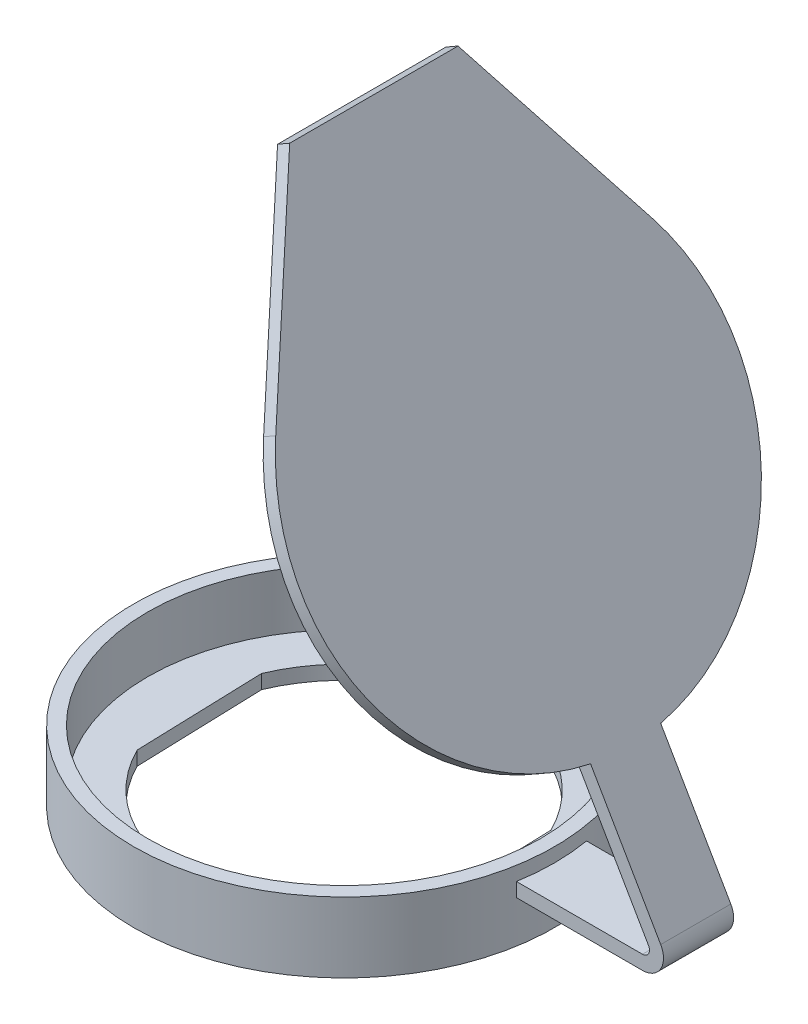
ISO-10303-21;
HEADER;
FILE_DESCRIPTION(('STEP AP214'),'2;1');
FILE_NAME('part.step','',(''),(''),'','','');
FILE_SCHEMA(('AUTOMOTIVE_DESIGN { 1 0 10303 214 1 1 1 1 }'));
ENDSEC;
DATA;
#1=APPLICATION_CONTEXT('core data for automotive mechanical design processes');
#2=APPLICATION_PROTOCOL_DEFINITION('international standard','automotive_design',2000,#1);
#3=PRODUCT_CONTEXT('',#1,'mechanical');
#4=PRODUCT('Part','Part','',(#3));
#5=PRODUCT_RELATED_PRODUCT_CATEGORY('part','',(#4));
#6=PRODUCT_DEFINITION_FORMATION('','',#4);
#7=PRODUCT_DEFINITION_CONTEXT('part definition',#1,'design');
#8=PRODUCT_DEFINITION('design','',#6,#7);
#9=PRODUCT_DEFINITION_SHAPE('','',#8);
#10=(LENGTH_UNIT() NAMED_UNIT(*) SI_UNIT(.MILLI.,.METRE.));
#11=(NAMED_UNIT(*) PLANE_ANGLE_UNIT() SI_UNIT($,.RADIAN.));
#12=(NAMED_UNIT(*) SI_UNIT($,.STERADIAN.) SOLID_ANGLE_UNIT());
#13=UNCERTAINTY_MEASURE_WITH_UNIT(LENGTH_MEASURE(1.E-05),#10,'distance_accuracy_value','');
#14=(GEOMETRIC_REPRESENTATION_CONTEXT(3) GLOBAL_UNCERTAINTY_ASSIGNED_CONTEXT((#13)) GLOBAL_UNIT_ASSIGNED_CONTEXT((#10,
#11,#12)) REPRESENTATION_CONTEXT('',''));
#15=CARTESIAN_POINT('',(0.,0.,0.));
#16=DIRECTION('',(0.,0.,1.));
#17=DIRECTION('',(1.,0.,0.));
#18=AXIS2_PLACEMENT_3D('',#15,#16,#17);
#19=CARTESIAN_POINT('',(0.,5.,0.));
#20=DIRECTION('',(0.,-1.,0.));
#21=DIRECTION('',(0.,0.,-1.));
#22=AXIS2_PLACEMENT_3D('',#19,#20,#21);
#23=CYLINDRICAL_SURFACE('',#22,15.);
#24=CARTESIAN_POINT('',(0.,0.,0.));
#25=DIRECTION('',(0.,1.,0.));
#26=DIRECTION('',(0.,0.,1.));
#27=AXIS2_PLACEMENT_3D('',#24,#25,#26);
#28=CIRCLE('',#27,15.);
#29=CARTESIAN_POINT('',(0.,0.,15.));
#30=VERTEX_POINT('',#29);
#31=EDGE_CURVE('E324',#30,#30,#28,.T.);
#32=ORIENTED_EDGE('',*,*,#31,.T.);
#33=EDGE_LOOP('',(#32));
#34=FACE_BOUND('',#33,.T.);
#35=CARTESIAN_POINT('',(0.,5.,0.));
#36=DIRECTION('',(0.,1.,0.));
#37=DIRECTION('',(0.,0.,1.));
#38=AXIS2_PLACEMENT_3D('',#35,#36,#37);
#39=CIRCLE('',#38,15.);
#40=CARTESIAN_POINT('',(0.,5.,15.));
#41=VERTEX_POINT('',#40);
#42=EDGE_CURVE('E42',#41,#41,#39,.T.);
#43=ORIENTED_EDGE('',*,*,#42,.F.);
#44=EDGE_LOOP('',(#43));
#45=FACE_BOUND('',#44,.T.);
#46=CARTESIAN_POINT('',(0.,4.,0.));
#47=DIRECTION('',(0.,1.,0.));
#48=DIRECTION('',(0.,0.,-1.));
#49=AXIS2_PLACEMENT_3D('',#46,#47,#48);
#50=CIRCLE('',#49,15.);
#51=CARTESIAN_POINT('',(14.790199457749,4.,2.5));
#52=VERTEX_POINT('',#51);
#53=CARTESIAN_POINT('',(14.790199457749,4.,-2.5));
#54=VERTEX_POINT('',#53);
#55=EDGE_CURVE('E232',#52,#54,#50,.T.);
#56=ORIENTED_EDGE('',*,*,#55,.T.);
#57=DIRECTION('',(0.,-1.,0.));
#58=VECTOR('',#57,1.);
#59=CARTESIAN_POINT('',(14.790199457749,4.,-2.5));
#60=LINE('',#59,#58);
#61=CARTESIAN_POINT('',(14.790199457749,3.,-2.5));
#62=VERTEX_POINT('',#61);
#63=EDGE_CURVE('E244',#54,#62,#60,.T.);
#64=ORIENTED_EDGE('',*,*,#63,.T.);
#65=CARTESIAN_POINT('',(0.,3.,0.));
#66=DIRECTION('',(0.,1.,0.));
#67=DIRECTION('',(0.,0.,-1.));
#68=AXIS2_PLACEMENT_3D('',#65,#66,#67);
#69=CIRCLE('',#68,15.);
#70=CARTESIAN_POINT('',(14.790199457749,3.,2.5));
#71=VERTEX_POINT('',#70);
#72=EDGE_CURVE('E231',#71,#62,#69,.T.);
#73=ORIENTED_EDGE('',*,*,#72,.F.);
#74=DIRECTION('',(0.,-1.,0.));
#75=VECTOR('',#74,1.);
#76=CARTESIAN_POINT('',(14.790199457749,4.,2.5));
#77=LINE('',#76,#75);
#78=EDGE_CURVE('E252',#52,#71,#77,.T.);
#79=ORIENTED_EDGE('',*,*,#78,.F.);
#80=EDGE_LOOP('',(#56,#64,#73,#79));
#81=FACE_BOUND('',#80,.T.);
#82=ADVANCED_FACE('F35',(#34,#45,#81),#23,.T.);
#83=CARTESIAN_POINT('',(0.,5.,0.));
#84=DIRECTION('',(0.,1.,0.));
#85=DIRECTION('',(0.,0.,1.));
#86=AXIS2_PLACEMENT_3D('',#83,#84,#85);
#87=PLANE('',#86);
#88=CARTESIAN_POINT('',(0.,5.,0.));
#89=DIRECTION('',(0.,1.,0.));
#90=DIRECTION('',(0.,0.,1.));
#91=AXIS2_PLACEMENT_3D('',#88,#89,#90);
#92=CIRCLE('',#91,14.);
#93=CARTESIAN_POINT('',(0.,5.,14.));
#94=VERTEX_POINT('',#93);
#95=EDGE_CURVE('E321',#94,#94,#92,.T.);
#96=ORIENTED_EDGE('',*,*,#95,.F.);
#97=EDGE_LOOP('',(#96));
#98=FACE_BOUND('',#97,.T.);
#99=ORIENTED_EDGE('',*,*,#42,.T.);
#100=EDGE_LOOP('',(#99));
#101=FACE_BOUND('',#100,.T.);
#102=ADVANCED_FACE('F334',(#98,#101),#87,.T.);
#103=CARTESIAN_POINT('',(0.,0.,0.));
#104=DIRECTION('',(0.,1.,0.));
#105=DIRECTION('',(0.,0.,1.));
#106=AXIS2_PLACEMENT_3D('',#103,#104,#105);
#107=PLANE('',#106);
#108=DIRECTION('',(-0.999489060573524,0.,0.0319627563557251));
#109=VECTOR('',#108,1.);
#110=CARTESIAN_POINT('',(-0.319627563557251,0.,-9.99489060573523));
#111=LINE('',#110,#109);
#112=CARTESIAN_POINT('',(4.26060671280123,0.,-10.1413623561548));
#113=VERTEX_POINT('',#112);
#114=CARTESIAN_POINT('',(-4.89986183991573,0.,-9.84841885531569));
#115=VERTEX_POINT('',#114);
#116=EDGE_CURVE('E312',#113,#115,#111,.T.);
#117=ORIENTED_EDGE('',*,*,#116,.T.);
#118=CARTESIAN_POINT('',(0.,0.,0.));
#119=DIRECTION('',(0.,1.,0.));
#120=DIRECTION('',(0.,0.,1.));
#121=AXIS2_PLACEMENT_3D('',#118,#119,#120);
#122=CIRCLE('',#121,11.);
#123=CARTESIAN_POINT('',(-10.1413623561548,0.,-4.26060671280123));
#124=VERTEX_POINT('',#123);
#125=EDGE_CURVE('E315',#115,#124,#122,.T.);
#126=ORIENTED_EDGE('',*,*,#125,.T.);
#127=DIRECTION('',(0.0319627563557248,0.,0.999489060573524));
#128=VECTOR('',#127,1.);
#129=CARTESIAN_POINT('',(-9.99489060573524,0.,0.319627563557248));
#130=LINE('',#129,#128);
#131=CARTESIAN_POINT('',(-9.8484188553157,0.,4.89986183991572));
#132=VERTEX_POINT('',#131);
#133=EDGE_CURVE('E281',#124,#132,#130,.T.);
#134=ORIENTED_EDGE('',*,*,#133,.T.);
#135=CARTESIAN_POINT('',(0.,0.,0.));
#136=DIRECTION('',(0.,1.,0.));
#137=DIRECTION('',(0.,0.,1.));
#138=AXIS2_PLACEMENT_3D('',#135,#136,#137);
#139=CIRCLE('',#138,11.);
#140=CARTESIAN_POINT('',(-4.26060671280122,0.,10.1413623561548));
#141=VERTEX_POINT('',#140);
#142=EDGE_CURVE('E297',#132,#141,#139,.T.);
#143=ORIENTED_EDGE('',*,*,#142,.T.);
#144=DIRECTION('',(0.999489060573524,0.,-0.031962756355725));
#145=VECTOR('',#144,1.);
#146=CARTESIAN_POINT('',(0.31962756355725,0.,9.99489060573524));
#147=LINE('',#146,#145);
#148=CARTESIAN_POINT('',(4.89986183991572,0.,9.8484188553157));
#149=VERTEX_POINT('',#148);
#150=EDGE_CURVE('E300',#141,#149,#147,.T.);
#151=ORIENTED_EDGE('',*,*,#150,.T.);
#152=CARTESIAN_POINT('',(0.,0.,0.));
#153=DIRECTION('',(0.,1.,0.));
#154=DIRECTION('',(0.,0.,1.));
#155=AXIS2_PLACEMENT_3D('',#152,#153,#154);
#156=CIRCLE('',#155,11.);
#157=CARTESIAN_POINT('',(10.1413623561548,0.,4.26060671280122));
#158=VERTEX_POINT('',#157);
#159=EDGE_CURVE('E303',#149,#158,#156,.T.);
#160=ORIENTED_EDGE('',*,*,#159,.T.);
#161=DIRECTION('',(-0.0319627563557248,0.,-0.999489060573524));
#162=VECTOR('',#161,1.);
#163=CARTESIAN_POINT('',(9.99489060573524,0.,-0.319627563557248));
#164=LINE('',#163,#162);
#165=CARTESIAN_POINT('',(9.8484188553157,0.,-4.89986183991572));
#166=VERTEX_POINT('',#165);
#167=EDGE_CURVE('E306',#158,#166,#164,.T.);
#168=ORIENTED_EDGE('',*,*,#167,.T.);
#169=CARTESIAN_POINT('',(0.,0.,0.));
#170=DIRECTION('',(0.,1.,0.));
#171=DIRECTION('',(0.,0.,1.));
#172=AXIS2_PLACEMENT_3D('',#169,#170,#171);
#173=CIRCLE('',#172,11.);
#174=EDGE_CURVE('E309',#166,#113,#173,.T.);
#175=ORIENTED_EDGE('',*,*,#174,.T.);
#176=EDGE_LOOP('',(#117,#126,#134,#143,#151,#160,#168,#175));
#177=FACE_BOUND('',#176,.T.);
#178=ORIENTED_EDGE('',*,*,#31,.F.);
#179=EDGE_LOOP('',(#178));
#180=FACE_BOUND('',#179,.T.);
#181=ADVANCED_FACE('F331',(#177,#180),#107,.F.);
#182=CARTESIAN_POINT('',(0.,5.,0.));
#183=DIRECTION('',(0.,-1.,0.));
#184=DIRECTION('',(0.,0.,-1.));
#185=AXIS2_PLACEMENT_3D('',#182,#183,#184);
#186=CYLINDRICAL_SURFACE('',#185,14.);
#187=ORIENTED_EDGE('',*,*,#95,.T.);
#188=EDGE_LOOP('',(#187));
#189=FACE_BOUND('',#188,.T.);
#190=CARTESIAN_POINT('',(0.,1.,0.));
#191=DIRECTION('',(0.,1.,0.));
#192=DIRECTION('',(0.,0.,1.));
#193=AXIS2_PLACEMENT_3D('',#190,#191,#192);
#194=CIRCLE('',#193,14.);
#195=CARTESIAN_POINT('',(0.,1.,14.));
#196=VERTEX_POINT('',#195);
#197=EDGE_CURVE('E318',#196,#196,#194,.T.);
#198=ORIENTED_EDGE('',*,*,#197,.F.);
#199=EDGE_LOOP('',(#198));
#200=FACE_BOUND('',#199,.T.);
#201=ADVANCED_FACE('F333',(#189,#200),#186,.F.);
#202=CARTESIAN_POINT('',(0.,1.,0.));
#203=DIRECTION('',(0.,1.,0.));
#204=DIRECTION('',(0.,0.,1.));
#205=AXIS2_PLACEMENT_3D('',#202,#203,#204);
#206=PLANE('',#205);
#207=CARTESIAN_POINT('',(0.,1.,0.));
#208=DIRECTION('',(0.,1.,0.));
#209=DIRECTION('',(0.,0.,1.));
#210=AXIS2_PLACEMENT_3D('',#207,#208,#209);
#211=CIRCLE('',#210,11.);
#212=CARTESIAN_POINT('',(-4.89986183991573,1.,-9.84841885531569));
#213=VERTEX_POINT('',#212);
#214=CARTESIAN_POINT('',(-10.1413623561548,1.,-4.26060671280122));
#215=VERTEX_POINT('',#214);
#216=EDGE_CURVE('E254',#213,#215,#211,.T.);
#217=ORIENTED_EDGE('',*,*,#216,.F.);
#218=DIRECTION('',(-0.999489060573524,0.,0.0319627563557251));
#219=VECTOR('',#218,1.);
#220=CARTESIAN_POINT('',(4.26060671280123,1.,-10.1413623561548));
#221=LINE('',#220,#219);
#222=CARTESIAN_POINT('',(4.26060671280123,1.,-10.1413623561548));
#223=VERTEX_POINT('',#222);
#224=EDGE_CURVE('E275',#223,#213,#221,.T.);
#225=ORIENTED_EDGE('',*,*,#224,.F.);
#226=CARTESIAN_POINT('',(0.,1.,0.));
#227=DIRECTION('',(0.,1.,0.));
#228=DIRECTION('',(0.,0.,1.));
#229=AXIS2_PLACEMENT_3D('',#226,#227,#228);
#230=CIRCLE('',#229,11.);
#231=CARTESIAN_POINT('',(9.8484188553157,1.,-4.89986183991572));
#232=VERTEX_POINT('',#231);
#233=EDGE_CURVE('E272',#232,#223,#230,.T.);
#234=ORIENTED_EDGE('',*,*,#233,.F.);
#235=DIRECTION('',(-0.0319627563557248,0.,-0.999489060573523));
#236=VECTOR('',#235,1.);
#237=CARTESIAN_POINT('',(10.1413623561548,1.,4.26060671280122));
#238=LINE('',#237,#236);
#239=CARTESIAN_POINT('',(10.1413623561548,1.,4.26060671280122));
#240=VERTEX_POINT('',#239);
#241=EDGE_CURVE('E269',#240,#232,#238,.T.);
#242=ORIENTED_EDGE('',*,*,#241,.F.);
#243=CARTESIAN_POINT('',(0.,1.,0.));
#244=DIRECTION('',(0.,1.,0.));
#245=DIRECTION('',(0.,0.,1.));
#246=AXIS2_PLACEMENT_3D('',#243,#244,#245);
#247=CIRCLE('',#246,11.);
#248=CARTESIAN_POINT('',(4.89986183991572,1.,9.8484188553157));
#249=VERTEX_POINT('',#248);
#250=EDGE_CURVE('E266',#249,#240,#247,.T.);
#251=ORIENTED_EDGE('',*,*,#250,.F.);
#252=DIRECTION('',(0.999489060573524,0.,-0.031962756355725));
#253=VECTOR('',#252,1.);
#254=CARTESIAN_POINT('',(-4.26060671280122,1.,10.1413623561548));
#255=LINE('',#254,#253);
#256=CARTESIAN_POINT('',(-4.26060671280122,1.,10.1413623561548));
#257=VERTEX_POINT('',#256);
#258=EDGE_CURVE('E263',#257,#249,#255,.T.);
#259=ORIENTED_EDGE('',*,*,#258,.F.);
#260=CARTESIAN_POINT('',(0.,1.,0.));
#261=DIRECTION('',(0.,1.,0.));
#262=DIRECTION('',(0.,0.,1.));
#263=AXIS2_PLACEMENT_3D('',#260,#261,#262);
#264=CIRCLE('',#263,11.);
#265=CARTESIAN_POINT('',(-9.8484188553157,1.,4.89986183991572));
#266=VERTEX_POINT('',#265);
#267=EDGE_CURVE('E260',#266,#257,#264,.T.);
#268=ORIENTED_EDGE('',*,*,#267,.F.);
#269=DIRECTION('',(0.0319627563557248,0.,0.999489060573523));
#270=VECTOR('',#269,1.);
#271=CARTESIAN_POINT('',(-10.1413623561548,1.,-4.26060671280123));
#272=LINE('',#271,#270);
#273=EDGE_CURVE('E258',#215,#266,#272,.T.);
#274=ORIENTED_EDGE('',*,*,#273,.F.);
#275=EDGE_LOOP('',(#217,#225,#234,#242,#251,#259,#268,#274));
#276=FACE_BOUND('',#275,.T.);
#277=ORIENTED_EDGE('',*,*,#197,.T.);
#278=EDGE_LOOP('',(#277));
#279=FACE_BOUND('',#278,.T.);
#280=ADVANCED_FACE('F340',(#276,#279),#206,.T.);
#281=CARTESIAN_POINT('',(0.,-4.,0.));
#282=DIRECTION('',(0.,1.,0.));
#283=DIRECTION('',(0.,0.,1.));
#284=AXIS2_PLACEMENT_3D('',#281,#282,#283);
#285=CYLINDRICAL_SURFACE('',#284,11.);
#286=DIRECTION('',(0.,1.,0.));
#287=VECTOR('',#286,1.);
#288=CARTESIAN_POINT('',(-4.89986183991573,-4.,-9.84841885531569));
#289=LINE('',#288,#287);
#290=EDGE_CURVE('E279',#115,#213,#289,.T.);
#291=ORIENTED_EDGE('',*,*,#290,.T.);
#292=ORIENTED_EDGE('',*,*,#216,.T.);
#293=DIRECTION('',(0.,1.,0.));
#294=VECTOR('',#293,1.);
#295=CARTESIAN_POINT('',(-10.1413623561548,-4.,-4.26060671280123));
#296=LINE('',#295,#294);
#297=EDGE_CURVE('E278',#124,#215,#296,.T.);
#298=ORIENTED_EDGE('',*,*,#297,.F.);
#299=ORIENTED_EDGE('',*,*,#125,.F.);
#300=EDGE_LOOP('',(#291,#292,#298,#299));
#301=FACE_BOUND('',#300,.T.);
#302=ADVANCED_FACE('F373',(#301),#285,.F.);
#303=CARTESIAN_POINT('',(4.26060671280123,-4.,-10.1413623561548));
#304=DIRECTION('',(-0.0319627563557251,0.,-0.999489060573524));
#305=DIRECTION('',(-0.999489060573524,0.,0.0319627563557251));
#306=AXIS2_PLACEMENT_3D('',#303,#304,#305);
#307=PLANE('',#306);
#308=DIRECTION('',(0.,1.,0.));
#309=VECTOR('',#308,1.);
#310=CARTESIAN_POINT('',(4.26060671280123,-4.,-10.1413623561548));
#311=LINE('',#310,#309);
#312=EDGE_CURVE('E282',#113,#223,#311,.T.);
#313=ORIENTED_EDGE('',*,*,#312,.T.);
#314=ORIENTED_EDGE('',*,*,#224,.T.);
#315=ORIENTED_EDGE('',*,*,#290,.F.);
#316=ORIENTED_EDGE('',*,*,#116,.F.);
#317=EDGE_LOOP('',(#313,#314,#315,#316));
#318=FACE_BOUND('',#317,.T.);
#319=ADVANCED_FACE('F383',(#318),#307,.F.);
#320=CARTESIAN_POINT('',(0.,-4.,0.));
#321=DIRECTION('',(0.,1.,0.));
#322=DIRECTION('',(0.,0.,1.));
#323=AXIS2_PLACEMENT_3D('',#320,#321,#322);
#324=CYLINDRICAL_SURFACE('',#323,11.);
#325=DIRECTION('',(0.,1.,0.));
#326=VECTOR('',#325,1.);
#327=CARTESIAN_POINT('',(9.8484188553157,-4.,-4.89986183991572));
#328=LINE('',#327,#326);
#329=EDGE_CURVE('E284',#166,#232,#328,.T.);
#330=ORIENTED_EDGE('',*,*,#329,.T.);
#331=ORIENTED_EDGE('',*,*,#233,.T.);
#332=ORIENTED_EDGE('',*,*,#312,.F.);
#333=ORIENTED_EDGE('',*,*,#174,.F.);
#334=EDGE_LOOP('',(#330,#331,#332,#333));
#335=FACE_BOUND('',#334,.T.);
#336=ADVANCED_FACE('F393',(#335),#324,.F.);
#337=CARTESIAN_POINT('',(10.1413623561548,-4.,4.26060671280122));
#338=DIRECTION('',(0.999489060573524,0.,-0.0319627563557248));
#339=DIRECTION('',(-0.0319627563557248,0.,-0.999489060573524));
#340=AXIS2_PLACEMENT_3D('',#337,#338,#339);
#341=PLANE('',#340);
#342=DIRECTION('',(0.,1.,0.));
#343=VECTOR('',#342,1.);
#344=CARTESIAN_POINT('',(10.1413623561548,-4.,4.26060671280122));
#345=LINE('',#344,#343);
#346=EDGE_CURVE('E286',#158,#240,#345,.T.);
#347=ORIENTED_EDGE('',*,*,#346,.T.);
#348=ORIENTED_EDGE('',*,*,#241,.T.);
#349=ORIENTED_EDGE('',*,*,#329,.F.);
#350=ORIENTED_EDGE('',*,*,#167,.F.);
#351=EDGE_LOOP('',(#347,#348,#349,#350));
#352=FACE_BOUND('',#351,.T.);
#353=ADVANCED_FACE('F403',(#352),#341,.F.);
#354=CARTESIAN_POINT('',(0.,-4.,0.));
#355=DIRECTION('',(0.,1.,0.));
#356=DIRECTION('',(0.,0.,1.));
#357=AXIS2_PLACEMENT_3D('',#354,#355,#356);
#358=CYLINDRICAL_SURFACE('',#357,11.);
#359=DIRECTION('',(0.,1.,0.));
#360=VECTOR('',#359,1.);
#361=CARTESIAN_POINT('',(4.89986183991572,-4.,9.8484188553157));
#362=LINE('',#361,#360);
#363=EDGE_CURVE('E288',#149,#249,#362,.T.);
#364=ORIENTED_EDGE('',*,*,#363,.T.);
#365=ORIENTED_EDGE('',*,*,#250,.T.);
#366=ORIENTED_EDGE('',*,*,#346,.F.);
#367=ORIENTED_EDGE('',*,*,#159,.F.);
#368=EDGE_LOOP('',(#364,#365,#366,#367));
#369=FACE_BOUND('',#368,.T.);
#370=ADVANCED_FACE('F413',(#369),#358,.F.);
#371=CARTESIAN_POINT('',(-4.26060671280122,-4.,10.1413623561548));
#372=DIRECTION('',(0.031962756355725,0.,0.999489060573524));
#373=DIRECTION('',(0.999489060573524,0.,-0.031962756355725));
#374=AXIS2_PLACEMENT_3D('',#371,#372,#373);
#375=PLANE('',#374);
#376=DIRECTION('',(0.,1.,0.));
#377=VECTOR('',#376,1.);
#378=CARTESIAN_POINT('',(-4.26060671280122,-4.,10.1413623561548));
#379=LINE('',#378,#377);
#380=EDGE_CURVE('E290',#141,#257,#379,.T.);
#381=ORIENTED_EDGE('',*,*,#380,.T.);
#382=ORIENTED_EDGE('',*,*,#258,.T.);
#383=ORIENTED_EDGE('',*,*,#363,.F.);
#384=ORIENTED_EDGE('',*,*,#150,.F.);
#385=EDGE_LOOP('',(#381,#382,#383,#384));
#386=FACE_BOUND('',#385,.T.);
#387=ADVANCED_FACE('F423',(#386),#375,.F.);
#388=CARTESIAN_POINT('',(0.,-4.,0.));
#389=DIRECTION('',(0.,1.,0.));
#390=DIRECTION('',(0.,0.,1.));
#391=AXIS2_PLACEMENT_3D('',#388,#389,#390);
#392=CYLINDRICAL_SURFACE('',#391,11.);
#393=DIRECTION('',(0.,1.,0.));
#394=VECTOR('',#393,1.);
#395=CARTESIAN_POINT('',(-9.8484188553157,-4.,4.89986183991572));
#396=LINE('',#395,#394);
#397=EDGE_CURVE('E57',#132,#266,#396,.T.);
#398=ORIENTED_EDGE('',*,*,#397,.T.);
#399=ORIENTED_EDGE('',*,*,#267,.T.);
#400=ORIENTED_EDGE('',*,*,#380,.F.);
#401=ORIENTED_EDGE('',*,*,#142,.F.);
#402=EDGE_LOOP('',(#398,#399,#400,#401));
#403=FACE_BOUND('',#402,.T.);
#404=ADVANCED_FACE('F433',(#403),#392,.F.);
#405=CARTESIAN_POINT('',(-10.1413623561548,-4.,-4.26060671280123));
#406=DIRECTION('',(-0.999489060573524,0.,0.0319627563557248));
#407=DIRECTION('',(0.0319627563557248,0.,0.999489060573524));
#408=AXIS2_PLACEMENT_3D('',#405,#406,#407);
#409=PLANE('',#408);
#410=ORIENTED_EDGE('',*,*,#297,.T.);
#411=ORIENTED_EDGE('',*,*,#273,.T.);
#412=ORIENTED_EDGE('',*,*,#397,.F.);
#413=ORIENTED_EDGE('',*,*,#133,.F.);
#414=EDGE_LOOP('',(#410,#411,#412,#413));
#415=FACE_BOUND('',#414,.T.);
#416=ADVANCED_FACE('F442',(#415),#409,.F.);
#417=CARTESIAN_POINT('',(14.790199457749,4.,2.5));
#418=DIRECTION('',(0.,0.,1.));
#419=DIRECTION('',(1.,0.,0.));
#420=AXIS2_PLACEMENT_3D('',#417,#418,#419);
#421=PLANE('',#420);
#422=DIRECTION('',(-1.,0.,0.));
#423=VECTOR('',#422,1.);
#424=CARTESIAN_POINT('',(14.790199457749,3.,2.5));
#425=LINE('',#424,#423);
#426=CARTESIAN_POINT('',(23.7749773139559,3.,2.5));
#427=VERTEX_POINT('',#426);
#428=EDGE_CURVE('E49',#427,#71,#425,.T.);
#429=ORIENTED_EDGE('',*,*,#428,.F.);
#430=CARTESIAN_POINT('',(23.7749773139559,4.49999999999971,2.5));
#431=DIRECTION('',(0.,0.,1.));
#432=DIRECTION('',(1.,0.,0.));
#433=AXIS2_PLACEMENT_3D('',#430,#431,#432);
#434=CIRCLE('',#433,1.49999999999982);
#435=CARTESIAN_POINT('',(25.0740154196324,5.24999999999966,2.5));
#436=VERTEX_POINT('',#435);
#437=EDGE_CURVE('E209',#427,#436,#434,.T.);
#438=ORIENTED_EDGE('',*,*,#437,.T.);
#439=DIRECTION('',(-0.499999999999998,0.86602540378444,0.));
#440=VECTOR('',#439,1.);
#441=CARTESIAN_POINT('',(25.0740154196325,5.24999999999971,2.5));
#442=LINE('',#441,#440);
#443=CARTESIAN_POINT('',(20.0740154196326,13.910254037844,2.5));
#444=VERTEX_POINT('',#443);
#445=EDGE_CURVE('E212',#436,#444,#442,.T.);
#446=ORIENTED_EDGE('',*,*,#445,.T.);
#447=DIRECTION('',(-0.86602540378444,-0.499999999999998,0.));
#448=VECTOR('',#447,1.);
#449=CARTESIAN_POINT('',(20.0740154196326,13.910254037844,2.5));
#450=LINE('',#449,#448);
#451=CARTESIAN_POINT('',(19.2079900158481,13.4102540378439,2.5));
#452=VERTEX_POINT('',#451);
#453=EDGE_CURVE('E214',#444,#452,#450,.T.);
#454=ORIENTED_EDGE('',*,*,#453,.T.);
#455=DIRECTION('',(0.499999999999998,-0.86602540378444,0.));
#456=VECTOR('',#455,1.);
#457=CARTESIAN_POINT('',(24.207990015848,4.74999999999954,2.5));
#458=LINE('',#457,#456);
#459=CARTESIAN_POINT('',(24.207990015848,4.74999999999954,2.5));
#460=VERTEX_POINT('',#459);
#461=EDGE_CURVE('E179',#452,#460,#458,.T.);
#462=ORIENTED_EDGE('',*,*,#461,.T.);
#463=CARTESIAN_POINT('',(23.7749773139559,4.49999999999971,2.5));
#464=DIRECTION('',(0.,0.,-1.));
#465=DIRECTION('',(1.,0.,0.));
#466=AXIS2_PLACEMENT_3D('',#463,#464,#465);
#467=CIRCLE('',#466,0.499999999999769);
#468=CARTESIAN_POINT('',(23.7749773139559,4.,2.5));
#469=VERTEX_POINT('',#468);
#470=EDGE_CURVE('E207',#460,#469,#467,.T.);
#471=ORIENTED_EDGE('',*,*,#470,.T.);
#472=DIRECTION('',(-1.,0.,0.));
#473=VECTOR('',#472,1.);
#474=CARTESIAN_POINT('',(14.790199457749,4.,2.5));
#475=LINE('',#474,#473);
#476=EDGE_CURVE('E241',#469,#52,#475,.T.);
#477=ORIENTED_EDGE('',*,*,#476,.T.);
#478=ORIENTED_EDGE('',*,*,#78,.T.);
#479=EDGE_LOOP('',(#429,#438,#446,#454,#462,#471,#477,#478));
#480=FACE_BOUND('',#479,.T.);
#481=ADVANCED_FACE('F451',(#480),#421,.T.);
#482=CARTESIAN_POINT('',(14.790199457749,4.,-2.5));
#483=DIRECTION('',(0.,0.,-1.));
#484=DIRECTION('',(-1.,0.,0.));
#485=AXIS2_PLACEMENT_3D('',#482,#483,#484);
#486=PLANE('',#485);
#487=DIRECTION('',(1.,0.,0.));
#488=VECTOR('',#487,1.);
#489=CARTESIAN_POINT('',(14.790199457749,3.,-2.5));
#490=LINE('',#489,#488);
#491=CARTESIAN_POINT('',(23.7749773139559,3.,-2.5));
#492=VERTEX_POINT('',#491);
#493=EDGE_CURVE('E246',#62,#492,#490,.T.);
#494=ORIENTED_EDGE('',*,*,#493,.F.);
#495=ORIENTED_EDGE('',*,*,#63,.F.);
#496=DIRECTION('',(1.,0.,0.));
#497=VECTOR('',#496,1.);
#498=CARTESIAN_POINT('',(14.790199457749,4.,-2.5));
#499=LINE('',#498,#497);
#500=CARTESIAN_POINT('',(23.7749773139559,4.,-2.5));
#501=VERTEX_POINT('',#500);
#502=EDGE_CURVE('E235',#54,#501,#499,.T.);
#503=ORIENTED_EDGE('',*,*,#502,.T.);
#504=CARTESIAN_POINT('',(23.7749773139559,4.49999999999971,-2.5));
#505=DIRECTION('',(0.,0.,-1.));
#506=DIRECTION('',(1.,0.,0.));
#507=AXIS2_PLACEMENT_3D('',#504,#505,#506);
#508=CIRCLE('',#507,0.499999999999769);
#509=CARTESIAN_POINT('',(24.207990015848,4.74999999999954,-2.5));
#510=VERTEX_POINT('',#509);
#511=EDGE_CURVE('E199',#510,#501,#508,.T.);
#512=ORIENTED_EDGE('',*,*,#511,.F.);
#513=DIRECTION('',(0.499999999999998,-0.86602540378444,0.));
#514=VECTOR('',#513,1.);
#515=CARTESIAN_POINT('',(24.207990015848,4.74999999999954,-2.5));
#516=LINE('',#515,#514);
#517=CARTESIAN_POINT('',(19.2079900158481,13.4102540378439,-2.5));
#518=VERTEX_POINT('',#517);
#519=EDGE_CURVE('E210',#518,#510,#516,.T.);
#520=ORIENTED_EDGE('',*,*,#519,.F.);
#521=DIRECTION('',(-0.86602540378444,-0.499999999999998,0.));
#522=VECTOR('',#521,1.);
#523=CARTESIAN_POINT('',(20.0740154196326,13.910254037844,-2.5));
#524=LINE('',#523,#522);
#525=CARTESIAN_POINT('',(20.0740154196326,13.910254037844,-2.49999999999998));
#526=VERTEX_POINT('',#525);
#527=EDGE_CURVE('E222',#526,#518,#524,.T.);
#528=ORIENTED_EDGE('',*,*,#527,.F.);
#529=DIRECTION('',(-0.499999999999998,0.86602540378444,0.));
#530=VECTOR('',#529,1.);
#531=CARTESIAN_POINT('',(25.0740154196325,5.24999999999971,-2.5));
#532=LINE('',#531,#530);
#533=CARTESIAN_POINT('',(25.0740154196324,5.24999999999966,-2.5));
#534=VERTEX_POINT('',#533);
#535=EDGE_CURVE('E219',#534,#526,#532,.T.);
#536=ORIENTED_EDGE('',*,*,#535,.F.);
#537=CARTESIAN_POINT('',(23.7749773139559,4.49999999999971,-2.5));
#538=DIRECTION('',(0.,0.,1.));
#539=DIRECTION('',(1.,0.,0.));
#540=AXIS2_PLACEMENT_3D('',#537,#538,#539);
#541=CIRCLE('',#540,1.49999999999982);
#542=EDGE_CURVE('E201',#492,#534,#541,.T.);
#543=ORIENTED_EDGE('',*,*,#542,.F.);
#544=EDGE_LOOP('',(#494,#495,#503,#512,#520,#528,#536,#543));
#545=FACE_BOUND('',#544,.T.);
#546=ADVANCED_FACE('F460',(#545),#486,.T.);
#547=CARTESIAN_POINT('',(0.,4.,0.));
#548=DIRECTION('',(0.,-1.,0.));
#549=DIRECTION('',(0.,0.,-1.));
#550=AXIS2_PLACEMENT_3D('',#547,#548,#549);
#551=PLANE('',#550);
#552=ORIENTED_EDGE('',*,*,#55,.F.);
#553=ORIENTED_EDGE('',*,*,#476,.F.);
#554=DIRECTION('',(0.,0.,1.));
#555=VECTOR('',#554,1.);
#556=CARTESIAN_POINT('',(23.7749773139559,4.,-2.5));
#557=LINE('',#556,#555);
#558=EDGE_CURVE('E238',#501,#469,#557,.T.);
#559=ORIENTED_EDGE('',*,*,#558,.F.);
#560=ORIENTED_EDGE('',*,*,#502,.F.);
#561=EDGE_LOOP('',(#552,#553,#559,#560));
#562=FACE_BOUND('',#561,.T.);
#563=ADVANCED_FACE('F469',(#562),#551,.F.);
#564=CARTESIAN_POINT('',(0.,3.,0.));
#565=DIRECTION('',(0.,-1.,0.));
#566=DIRECTION('',(0.,0.,-1.));
#567=AXIS2_PLACEMENT_3D('',#564,#565,#566);
#568=PLANE('',#567);
#569=ORIENTED_EDGE('',*,*,#72,.T.);
#570=ORIENTED_EDGE('',*,*,#493,.T.);
#571=DIRECTION('',(0.,0.,1.));
#572=VECTOR('',#571,1.);
#573=CARTESIAN_POINT('',(23.7749773139559,3.,-2.5));
#574=LINE('',#573,#572);
#575=EDGE_CURVE('E249',#492,#427,#574,.T.);
#576=ORIENTED_EDGE('',*,*,#575,.T.);
#577=ORIENTED_EDGE('',*,*,#428,.T.);
#578=EDGE_LOOP('',(#569,#570,#576,#577));
#579=FACE_BOUND('',#578,.T.);
#580=ADVANCED_FACE('F477',(#579),#568,.T.);
#581=CARTESIAN_POINT('',(23.7749773139559,4.49999999999971,2.5));
#582=DIRECTION('',(0.,0.,-1.));
#583=DIRECTION('',(-1.,0.,0.));
#584=AXIS2_PLACEMENT_3D('',#581,#582,#583);
#585=CYLINDRICAL_SURFACE('',#584,0.499999999999769);
#586=ORIENTED_EDGE('',*,*,#511,.T.);
#587=ORIENTED_EDGE('',*,*,#558,.T.);
#588=ORIENTED_EDGE('',*,*,#470,.F.);
#589=DIRECTION('',(0.,0.,-1.));
#590=VECTOR('',#589,1.);
#591=CARTESIAN_POINT('',(24.207990015848,4.74999999999954,2.5));
#592=LINE('',#591,#590);
#593=EDGE_CURVE('E216',#460,#510,#592,.T.);
#594=ORIENTED_EDGE('',*,*,#593,.T.);
#595=EDGE_LOOP('',(#586,#587,#588,#594));
#596=FACE_BOUND('',#595,.T.);
#597=ADVANCED_FACE('F485',(#596),#585,.F.);
#598=CARTESIAN_POINT('',(23.7749773139559,4.49999999999971,2.5));
#599=DIRECTION('',(0.,0.,-1.));
#600=DIRECTION('',(-1.,0.,0.));
#601=AXIS2_PLACEMENT_3D('',#598,#599,#600);
#602=CYLINDRICAL_SURFACE('',#601,1.49999999999982);
#603=ORIENTED_EDGE('',*,*,#542,.T.);
#604=DIRECTION('',(0.,0.,-1.));
#605=VECTOR('',#604,1.);
#606=CARTESIAN_POINT('',(25.0740154196324,5.24999999999966,2.5));
#607=LINE('',#606,#605);
#608=EDGE_CURVE('E228',#436,#534,#607,.T.);
#609=ORIENTED_EDGE('',*,*,#608,.F.);
#610=ORIENTED_EDGE('',*,*,#437,.F.);
#611=ORIENTED_EDGE('',*,*,#575,.F.);
#612=EDGE_LOOP('',(#603,#609,#610,#611));
#613=FACE_BOUND('',#612,.T.);
#614=ADVANCED_FACE('F492',(#613),#602,.T.);
#615=CARTESIAN_POINT('',(25.0740154196325,5.24999999999971,2.5));
#616=DIRECTION('',(-0.86602540378444,-0.499999999999998,0.));
#617=DIRECTION('',(0.499999999999998,-0.86602540378444,0.));
#618=AXIS2_PLACEMENT_3D('',#615,#616,#617);
#619=PLANE('',#618);
#620=ORIENTED_EDGE('',*,*,#535,.T.);
#621=CARTESIAN_POINT('',(12.4254861492434,27.1578953373358,0.));
#622=DIRECTION('',(-0.86602540378444,-0.499999999999998,0.));
#623=DIRECTION('',(0.499999999999998,-0.86602540378444,0.));
#624=AXIS2_PLACEMENT_3D('',#621,#622,#623);
#625=CIRCLE('',#624,15.5);
#626=CARTESIAN_POINT('',(8.55048614924348,33.8695922166651,-13.4233937586588));
#627=VERTEX_POINT('',#626);
#628=EDGE_CURVE('E650',#627,#526,#625,.T.);
#629=ORIENTED_EDGE('',*,*,#628,.F.);
#630=DIRECTION('',(0.433012701892218,-0.750000000000003,-0.499999999999997));
#631=VECTOR('',#630,1.);
#632=CARTESIAN_POINT('',(2.12163857195007,45.0046828546535,-6.));
#633=LINE('',#632,#631);
#634=CARTESIAN_POINT('',(2.12163857195007,45.0046828546535,-6.));
#635=VERTEX_POINT('',#634);
#636=EDGE_CURVE('E184',#635,#627,#633,.T.);
#637=ORIENTED_EDGE('',*,*,#636,.F.);
#638=DIRECTION('',(0.,0.,-1.));
#639=VECTOR('',#638,1.);
#640=CARTESIAN_POINT('',(2.12163857195007,45.0046828546535,6.));
#641=LINE('',#640,#639);
#642=CARTESIAN_POINT('',(2.12163857195007,45.0046828546535,6.));
#643=VERTEX_POINT('',#642);
#644=EDGE_CURVE('E655',#643,#635,#641,.T.);
#645=ORIENTED_EDGE('',*,*,#644,.F.);
#646=DIRECTION('',(-0.433012701892218,0.750000000000003,-0.499999999999997));
#647=VECTOR('',#646,1.);
#648=CARTESIAN_POINT('',(8.55048614924348,33.8695922166651,13.4233937586588));
#649=LINE('',#648,#647);
#650=CARTESIAN_POINT('',(8.55048614924348,33.8695922166651,13.4233937586588));
#651=VERTEX_POINT('',#650);
#652=EDGE_CURVE('E653',#651,#643,#649,.T.);
#653=ORIENTED_EDGE('',*,*,#652,.F.);
#654=EDGE_CURVE('E197',#444,#651,#625,.T.);
#655=ORIENTED_EDGE('',*,*,#654,.F.);
#656=ORIENTED_EDGE('',*,*,#445,.F.);
#657=ORIENTED_EDGE('',*,*,#608,.T.);
#658=EDGE_LOOP('',(#620,#629,#637,#645,#653,#655,#656,#657));
#659=FACE_BOUND('',#658,.T.);
#660=ADVANCED_FACE('F499',(#659),#619,.F.);
#661=CARTESIAN_POINT('',(24.207990015848,4.74999999999954,2.5));
#662=DIRECTION('',(0.86602540378444,0.499999999999998,0.));
#663=DIRECTION('',(-0.499999999999998,0.86602540378444,0.));
#664=AXIS2_PLACEMENT_3D('',#661,#662,#663);
#665=PLANE('',#664);
#666=CARTESIAN_POINT('',(11.5594607454589,26.6578953373357,0.));
#667=DIRECTION('',(0.86602540378444,0.499999999999998,0.));
#668=DIRECTION('',(-0.499999999999998,0.86602540378444,0.));
#669=AXIS2_PLACEMENT_3D('',#666,#667,#668);
#670=CIRCLE('',#669,14.);
#671=CARTESIAN_POINT('',(4.55946074545893,38.7822509903179,0.));
#672=VERTEX_POINT('',#671);
#673=EDGE_CURVE('E11',#672,#672,#670,.F.);
#674=ORIENTED_EDGE('',*,*,#673,.F.);
#675=EDGE_LOOP('',(#674));
#676=FACE_BOUND('',#675,.T.);
#677=ORIENTED_EDGE('',*,*,#461,.F.);
#678=CARTESIAN_POINT('',(11.559460745459,26.6578953373358,0.));
#679=DIRECTION('',(-0.86602540378444,-0.499999999999998,0.));
#680=DIRECTION('',(0.499999999999998,-0.86602540378444,0.));
#681=AXIS2_PLACEMENT_3D('',#678,#679,#680);
#682=CIRCLE('',#681,15.5);
#683=CARTESIAN_POINT('',(7.68446074545903,33.3695922166651,13.4233937586588));
#684=VERTEX_POINT('',#683);
#685=EDGE_CURVE('E173',#452,#684,#682,.T.);
#686=ORIENTED_EDGE('',*,*,#685,.T.);
#687=DIRECTION('',(-0.433012701892218,0.750000000000003,-0.499999999999997));
#688=VECTOR('',#687,1.);
#689=CARTESIAN_POINT('',(7.68446074545903,33.3695922166651,13.4233937586588));
#690=LINE('',#689,#688);
#691=CARTESIAN_POINT('',(1.25561316816563,44.5046828546535,6.));
#692=VERTEX_POINT('',#691);
#693=EDGE_CURVE('E176',#684,#692,#690,.T.);
#694=ORIENTED_EDGE('',*,*,#693,.T.);
#695=DIRECTION('',(0.,0.,-1.));
#696=VECTOR('',#695,1.);
#697=CARTESIAN_POINT('',(1.25561316816563,44.5046828546535,6.));
#698=LINE('',#697,#696);
#699=CARTESIAN_POINT('',(1.25561316816563,44.5046828546535,-6.));
#700=VERTEX_POINT('',#699);
#701=EDGE_CURVE('E193',#692,#700,#698,.T.);
#702=ORIENTED_EDGE('',*,*,#701,.T.);
#703=DIRECTION('',(0.433012701892218,-0.750000000000003,-0.499999999999997));
#704=VECTOR('',#703,1.);
#705=CARTESIAN_POINT('',(1.25561316816563,44.5046828546535,-6.));
#706=LINE('',#705,#704);
#707=CARTESIAN_POINT('',(7.68446074545903,33.3695922166651,-13.4233937586588));
#708=VERTEX_POINT('',#707);
#709=EDGE_CURVE('E647',#700,#708,#706,.T.);
#710=ORIENTED_EDGE('',*,*,#709,.T.);
#711=EDGE_CURVE('E183',#708,#518,#682,.T.);
#712=ORIENTED_EDGE('',*,*,#711,.T.);
#713=ORIENTED_EDGE('',*,*,#519,.T.);
#714=ORIENTED_EDGE('',*,*,#593,.F.);
#715=EDGE_LOOP('',(#677,#686,#694,#702,#710,#712,#713,#714));
#716=FACE_BOUND('',#715,.T.);
#717=ADVANCED_FACE('F175',(#676,#716),#665,.F.);
#718=CARTESIAN_POINT('',(11.559460745459,26.6578953373358,0.));
#719=DIRECTION('',(0.86602540378444,0.499999999999998,0.));
#720=DIRECTION('',(-0.499999999999998,0.86602540378444,0.));
#721=AXIS2_PLACEMENT_3D('',#718,#719,#720);
#722=CYLINDRICAL_SURFACE('',#721,15.5);
#723=ORIENTED_EDGE('',*,*,#628,.T.);
#724=ORIENTED_EDGE('',*,*,#527,.T.);
#725=ORIENTED_EDGE('',*,*,#711,.F.);
#726=DIRECTION('',(0.86602540378444,0.499999999999998,0.));
#727=VECTOR('',#726,1.);
#728=CARTESIAN_POINT('',(7.68446074545903,33.3695922166651,-13.4233937586588));
#729=LINE('',#728,#727);
#730=EDGE_CURVE('E649',#708,#627,#729,.T.);
#731=ORIENTED_EDGE('',*,*,#730,.T.);
#732=EDGE_LOOP('',(#723,#724,#725,#731));
#733=FACE_BOUND('',#732,.T.);
#734=ADVANCED_FACE('F514',(#733),#722,.T.);
#735=ORIENTED_EDGE('',*,*,#685,.F.);
#736=ORIENTED_EDGE('',*,*,#453,.F.);
#737=ORIENTED_EDGE('',*,*,#654,.T.);
#738=DIRECTION('',(0.86602540378444,0.499999999999998,0.));
#739=VECTOR('',#738,1.);
#740=CARTESIAN_POINT('',(7.68446074545903,33.3695922166651,13.4233937586588));
#741=LINE('',#740,#739);
#742=EDGE_CURVE('E189',#684,#651,#741,.T.);
#743=ORIENTED_EDGE('',*,*,#742,.F.);
#744=EDGE_LOOP('',(#735,#736,#737,#743));
#745=FACE_BOUND('',#744,.T.);
#746=ADVANCED_FACE('F195',(#745),#722,.T.);
#747=CARTESIAN_POINT('',(7.68446074545903,33.3695922166651,13.4233937586588));
#748=DIRECTION('',(0.249999999999998,-0.433012701892218,-0.86602540378444));
#749=DIRECTION('',(0.,0.894427190999917,-0.447213595499956));
#750=AXIS2_PLACEMENT_3D('',#747,#748,#749);
#751=PLANE('',#750);
#752=ORIENTED_EDGE('',*,*,#652,.T.);
#753=DIRECTION('',(0.86602540378444,0.499999999999998,0.));
#754=VECTOR('',#753,1.);
#755=CARTESIAN_POINT('',(1.25561316816563,44.5046828546535,6.));
#756=LINE('',#755,#754);
#757=EDGE_CURVE('E191',#692,#643,#756,.T.);
#758=ORIENTED_EDGE('',*,*,#757,.F.);
#759=ORIENTED_EDGE('',*,*,#693,.F.);
#760=ORIENTED_EDGE('',*,*,#742,.T.);
#761=EDGE_LOOP('',(#752,#758,#759,#760));
#762=FACE_BOUND('',#761,.T.);
#763=ADVANCED_FACE('F188',(#762),#751,.F.);
#764=CARTESIAN_POINT('',(1.25561316816563,44.5046828546535,6.));
#765=DIRECTION('',(0.499999999999998,-0.86602540378444,0.));
#766=DIRECTION('',(0.86602540378444,0.499999999999998,0.));
#767=AXIS2_PLACEMENT_3D('',#764,#765,#766);
#768=PLANE('',#767);
#769=ORIENTED_EDGE('',*,*,#644,.T.);
#770=DIRECTION('',(0.86602540378444,0.499999999999998,0.));
#771=VECTOR('',#770,1.);
#772=CARTESIAN_POINT('',(1.25561316816563,44.5046828546535,-6.));
#773=LINE('',#772,#771);
#774=EDGE_CURVE('E203',#700,#635,#773,.T.);
#775=ORIENTED_EDGE('',*,*,#774,.F.);
#776=ORIENTED_EDGE('',*,*,#701,.F.);
#777=ORIENTED_EDGE('',*,*,#757,.T.);
#778=EDGE_LOOP('',(#769,#775,#776,#777));
#779=FACE_BOUND('',#778,.T.);
#780=ADVANCED_FACE('F536',(#779),#768,.F.);
#781=CARTESIAN_POINT('',(1.25561316816563,44.5046828546535,-6.));
#782=DIRECTION('',(0.249999999999998,-0.433012701892217,0.86602540378444));
#783=DIRECTION('',(0.,-0.894427190999917,-0.447213595499956));
#784=AXIS2_PLACEMENT_3D('',#781,#782,#783);
#785=PLANE('',#784);
#786=ORIENTED_EDGE('',*,*,#636,.T.);
#787=ORIENTED_EDGE('',*,*,#730,.F.);
#788=ORIENTED_EDGE('',*,*,#709,.F.);
#789=ORIENTED_EDGE('',*,*,#774,.T.);
#790=EDGE_LOOP('',(#786,#787,#788,#789));
#791=FACE_BOUND('',#790,.T.);
#792=ADVANCED_FACE('F543',(#791),#785,.F.);
#793=CARTESIAN_POINT('',(10.2604226397823,25.9078953373357,0.));
#794=DIRECTION('',(-0.86602540378444,-0.499999999999998,0.));
#795=DIRECTION('',(0.499999999999998,-0.86602540378444,0.));
#796=AXIS2_PLACEMENT_3D('',#793,#794,#795);
#797=PLANE('',#796);
#798=CARTESIAN_POINT('',(10.2604226397823,25.9078953373357,0.));
#799=DIRECTION('',(-0.86602540378444,-0.499999999999998,0.));
#800=DIRECTION('',(0.499999999999998,-0.86602540378444,0.));
#801=AXIS2_PLACEMENT_3D('',#798,#799,#800);
#802=CIRCLE('',#801,14.);
#803=CARTESIAN_POINT('',(17.2604226397822,13.7835396843536,0.));
#804=VERTEX_POINT('',#803);
#805=EDGE_CURVE('E640',#804,#804,#802,.T.);
#806=ORIENTED_EDGE('',*,*,#805,.T.);
#807=EDGE_LOOP('',(#806));
#808=FACE_BOUND('',#807,.T.);
#809=CARTESIAN_POINT('',(10.2604226397823,25.9078953373357,0.));
#810=DIRECTION('',(-0.86602540378444,-0.499999999999998,0.));
#811=DIRECTION('',(0.499999999999998,-0.86602540378444,0.));
#812=AXIS2_PLACEMENT_3D('',#809,#810,#811);
#813=CIRCLE('',#812,12.5);
#814=CARTESIAN_POINT('',(16.5104226397822,15.0825777900302,0.));
#815=VERTEX_POINT('',#814);
#816=EDGE_CURVE('E637',#815,#815,#813,.T.);
#817=ORIENTED_EDGE('',*,*,#816,.F.);
#818=EDGE_LOOP('',(#817));
#819=FACE_BOUND('',#818,.T.);
#820=ADVANCED_FACE('F550',(#808,#819),#797,.T.);
#821=CARTESIAN_POINT('',(10.2604226397823,25.9078953373357,0.));
#822=DIRECTION('',(0.86602540378444,0.499999999999998,0.));
#823=DIRECTION('',(-0.499999999999998,0.86602540378444,0.));
#824=AXIS2_PLACEMENT_3D('',#821,#822,#823);
#825=CYLINDRICAL_SURFACE('',#824,14.);
#826=ORIENTED_EDGE('',*,*,#805,.F.);
#827=EDGE_LOOP('',(#826));
#828=FACE_BOUND('',#827,.T.);
#829=ORIENTED_EDGE('',*,*,#673,.T.);
#830=EDGE_LOOP('',(#829));
#831=FACE_BOUND('',#830,.T.);
#832=ADVANCED_FACE('F557',(#828,#831),#825,.T.);
#833=CARTESIAN_POINT('',(10.2604226397823,25.9078953373357,0.));
#834=DIRECTION('',(0.86602540378444,0.499999999999998,0.));
#835=DIRECTION('',(-0.499999999999998,0.86602540378444,0.));
#836=AXIS2_PLACEMENT_3D('',#833,#834,#835);
#837=CYLINDRICAL_SURFACE('',#836,12.5);
#838=ORIENTED_EDGE('',*,*,#816,.T.);
#839=EDGE_LOOP('',(#838));
#840=FACE_BOUND('',#839,.T.);
#841=CARTESIAN_POINT('',(11.5594607454589,26.6578953373357,0.));
#842=DIRECTION('',(-0.86602540378444,-0.499999999999998,0.));
#843=DIRECTION('',(0.499999999999998,-0.86602540378444,0.));
#844=AXIS2_PLACEMENT_3D('',#841,#842,#843);
#845=CIRCLE('',#844,12.5);
#846=CARTESIAN_POINT('',(17.8094607454589,15.8325777900302,0.));
#847=VERTEX_POINT('',#846);
#848=EDGE_CURVE('E635',#847,#847,#845,.T.);
#849=ORIENTED_EDGE('',*,*,#848,.F.);
#850=EDGE_LOOP('',(#849));
#851=FACE_BOUND('',#850,.T.);
#852=ADVANCED_FACE('F565',(#840,#851),#837,.F.);
#853=ORIENTED_EDGE('',*,*,#848,.T.);
#854=EDGE_LOOP('',(#853));
#855=FACE_BOUND('',#854,.T.);
#856=ADVANCED_FACE('F517',(#855),#665,.F.);
#857=CLOSED_SHELL('',(#82,#102,#181,#201,#280,#302,#319,#336,#353,#370,#387,#404,#416,#481,#546,
#563,#580,#597,#614,#660,#717,#734,#746,#763,#780,#792,#820,#832,#852,#856));
#858=MANIFOLD_SOLID_BREP('B2',#857);
#859=ADVANCED_BREP_SHAPE_REPRESENTATION('',(#18,#858),#14);
#860=SHAPE_DEFINITION_REPRESENTATION(#9,#859);
ENDSEC;
END-ISO-10303-21;
